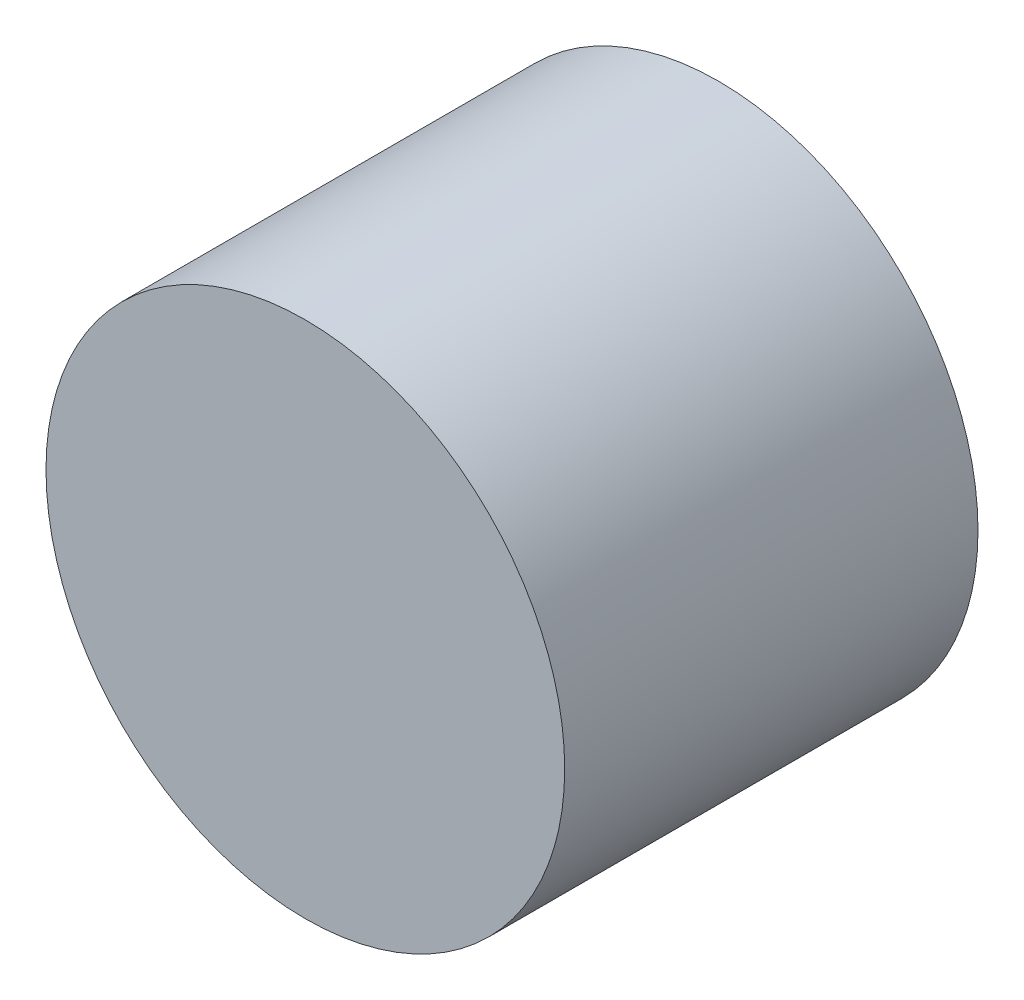
ISO-10303-21;
HEADER;
FILE_DESCRIPTION(('STEP AP214'),'2;1');
FILE_NAME('part.step','',(''),(''),'','','');
FILE_SCHEMA(('AUTOMOTIVE_DESIGN { 1 0 10303 214 1 1 1 1 }'));
ENDSEC;
DATA;
#1=APPLICATION_CONTEXT('core data for automotive mechanical design processes');
#2=APPLICATION_PROTOCOL_DEFINITION('international standard','automotive_design',2000,#1);
#3=PRODUCT_CONTEXT('',#1,'mechanical');
#4=PRODUCT('Part','Part','',(#3));
#5=PRODUCT_RELATED_PRODUCT_CATEGORY('part','',(#4));
#6=PRODUCT_DEFINITION_FORMATION('','',#4);
#7=PRODUCT_DEFINITION_CONTEXT('part definition',#1,'design');
#8=PRODUCT_DEFINITION('design','',#6,#7);
#9=PRODUCT_DEFINITION_SHAPE('','',#8);
#10=(LENGTH_UNIT() NAMED_UNIT(*) SI_UNIT(.MILLI.,.METRE.));
#11=(NAMED_UNIT(*) PLANE_ANGLE_UNIT() SI_UNIT($,.RADIAN.));
#12=(NAMED_UNIT(*) SI_UNIT($,.STERADIAN.) SOLID_ANGLE_UNIT());
#13=UNCERTAINTY_MEASURE_WITH_UNIT(LENGTH_MEASURE(1.E-05),#10,'distance_accuracy_value','');
#14=(GEOMETRIC_REPRESENTATION_CONTEXT(3) GLOBAL_UNCERTAINTY_ASSIGNED_CONTEXT((#13)) GLOBAL_UNIT_ASSIGNED_CONTEXT((#10,
#11,#12)) REPRESENTATION_CONTEXT('',''));
#15=CARTESIAN_POINT('',(0.,0.,0.));
#16=DIRECTION('',(0.,0.,1.));
#17=DIRECTION('',(1.,0.,0.));
#18=AXIS2_PLACEMENT_3D('',#15,#16,#17);
#19=CARTESIAN_POINT('',(-4.913,6.281,12.173));
#20=DIRECTION('',(0.,0.,-1.));
#21=DIRECTION('',(-1.,0.,0.));
#22=AXIS2_PLACEMENT_3D('',#19,#20,#21);
#23=CYLINDRICAL_SURFACE('',#22,7.639);
#24=CARTESIAN_POINT('',(-4.913,6.281,12.173));
#25=DIRECTION('',(0.,0.,1.));
#26=DIRECTION('',(1.,0.,0.));
#27=AXIS2_PLACEMENT_3D('',#24,#25,#26);
#28=CIRCLE('',#27,7.639);
#29=CARTESIAN_POINT('',(2.726,6.281,12.173));
#30=VERTEX_POINT('',#29);
#31=EDGE_CURVE('E10',#30,#30,#28,.T.);
#32=ORIENTED_EDGE('',*,*,#31,.F.);
#33=EDGE_LOOP('',(#32));
#34=FACE_BOUND('',#33,.T.);
#35=CARTESIAN_POINT('',(-4.913,6.281,0.));
#36=DIRECTION('',(0.,0.,1.));
#37=DIRECTION('',(1.,0.,0.));
#38=AXIS2_PLACEMENT_3D('',#35,#36,#37);
#39=CIRCLE('',#38,7.639);
#40=CARTESIAN_POINT('',(2.726,6.281,0.));
#41=VERTEX_POINT('',#40);
#42=EDGE_CURVE('E45',#41,#41,#39,.T.);
#43=ORIENTED_EDGE('',*,*,#42,.T.);
#44=EDGE_LOOP('',(#43));
#45=FACE_BOUND('',#44,.T.);
#46=ADVANCED_FACE('F39',(#34,#45),#23,.T.);
#47=CARTESIAN_POINT('',(-4.913,6.281,12.173));
#48=DIRECTION('',(0.,0.,1.));
#49=DIRECTION('',(1.,0.,0.));
#50=AXIS2_PLACEMENT_3D('',#47,#48,#49);
#51=PLANE('',#50);
#52=ORIENTED_EDGE('',*,*,#31,.T.);
#53=EDGE_LOOP('',(#52));
#54=FACE_BOUND('',#53,.T.);
#55=ADVANCED_FACE('F53',(#54),#51,.T.);
#56=CARTESIAN_POINT('',(-4.913,6.281,0.));
#57=DIRECTION('',(0.,0.,1.));
#58=DIRECTION('',(1.,0.,0.));
#59=AXIS2_PLACEMENT_3D('',#56,#57,#58);
#60=PLANE('',#59);
#61=ORIENTED_EDGE('',*,*,#42,.F.);
#62=EDGE_LOOP('',(#61));
#63=FACE_BOUND('',#62,.T.);
#64=ADVANCED_FACE('F55',(#63),#60,.F.);
#65=CLOSED_SHELL('',(#46,#55,#64));
#66=MANIFOLD_SOLID_BREP('B2',#65);
#67=ADVANCED_BREP_SHAPE_REPRESENTATION('',(#18,#66),#14);
#68=SHAPE_DEFINITION_REPRESENTATION(#9,#67);
ENDSEC;
END-ISO-10303-21;
